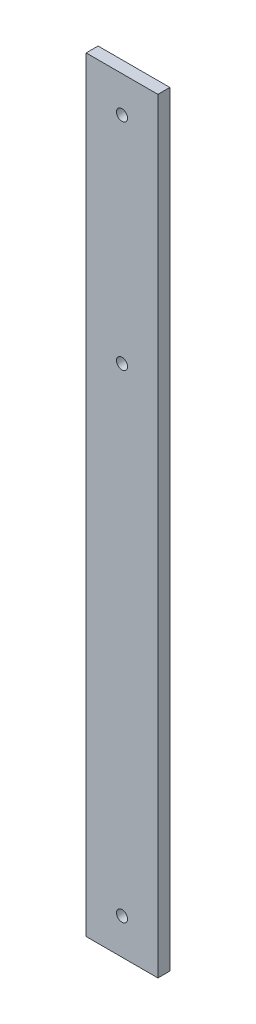
ISO-10303-21;
HEADER;
FILE_DESCRIPTION(('STEP AP214'),'2;1');
FILE_NAME('part.step','',(''),(''),'','','');
FILE_SCHEMA(('AUTOMOTIVE_DESIGN { 1 0 10303 214 1 1 1 1 }'));
ENDSEC;
DATA;
#1=APPLICATION_CONTEXT('core data for automotive mechanical design processes');
#2=APPLICATION_PROTOCOL_DEFINITION('international standard','automotive_design',2000,#1);
#3=PRODUCT_CONTEXT('',#1,'mechanical');
#4=PRODUCT('Part','Part','',(#3));
#5=PRODUCT_RELATED_PRODUCT_CATEGORY('part','',(#4));
#6=PRODUCT_DEFINITION_FORMATION('','',#4);
#7=PRODUCT_DEFINITION_CONTEXT('part definition',#1,'design');
#8=PRODUCT_DEFINITION('design','',#6,#7);
#9=PRODUCT_DEFINITION_SHAPE('','',#8);
#10=(LENGTH_UNIT() NAMED_UNIT(*) SI_UNIT(.MILLI.,.METRE.));
#11=(NAMED_UNIT(*) PLANE_ANGLE_UNIT() SI_UNIT($,.RADIAN.));
#12=(NAMED_UNIT(*) SI_UNIT($,.STERADIAN.) SOLID_ANGLE_UNIT());
#13=UNCERTAINTY_MEASURE_WITH_UNIT(LENGTH_MEASURE(1.E-05),#10,'distance_accuracy_value','');
#14=(GEOMETRIC_REPRESENTATION_CONTEXT(3) GLOBAL_UNCERTAINTY_ASSIGNED_CONTEXT((#13)) GLOBAL_UNIT_ASSIGNED_CONTEXT((#10,
#11,#12)) REPRESENTATION_CONTEXT('',''));
#15=CARTESIAN_POINT('',(0.,0.,0.));
#16=DIRECTION('',(0.,0.,1.));
#17=DIRECTION('',(1.,0.,0.));
#18=AXIS2_PLACEMENT_3D('',#15,#16,#17);
#19=CARTESIAN_POINT('',(0.,0.,3.175));
#20=DIRECTION('',(1.,0.,0.));
#21=DIRECTION('',(0.,0.,-1.));
#22=AXIS2_PLACEMENT_3D('',#19,#20,#21);
#23=PLANE('',#22);
#24=DIRECTION('',(0.,-1.,0.));
#25=VECTOR('',#24,1.);
#26=CARTESIAN_POINT('',(0.,0.,0.));
#27=LINE('',#26,#25);
#28=CARTESIAN_POINT('',(0.,203.2,0.));
#29=VERTEX_POINT('',#28);
#30=CARTESIAN_POINT('',(0.,0.,0.));
#31=VERTEX_POINT('',#30);
#32=EDGE_CURVE('E112',#29,#31,#27,.T.);
#33=ORIENTED_EDGE('',*,*,#32,.T.);
#34=DIRECTION('',(0.,0.,-1.));
#35=VECTOR('',#34,1.);
#36=CARTESIAN_POINT('',(0.,0.,3.175));
#37=LINE('',#36,#35);
#38=CARTESIAN_POINT('',(0.,0.,3.175));
#39=VERTEX_POINT('',#38);
#40=EDGE_CURVE('E11',#39,#31,#37,.T.);
#41=ORIENTED_EDGE('',*,*,#40,.F.);
#42=DIRECTION('',(0.,-1.,0.));
#43=VECTOR('',#42,1.);
#44=CARTESIAN_POINT('',(0.,0.,3.175));
#45=LINE('',#44,#43);
#46=CARTESIAN_POINT('',(0.,203.2,3.175));
#47=VERTEX_POINT('',#46);
#48=EDGE_CURVE('E96',#47,#39,#45,.T.);
#49=ORIENTED_EDGE('',*,*,#48,.F.);
#50=DIRECTION('',(0.,0.,-1.));
#51=VECTOR('',#50,1.);
#52=CARTESIAN_POINT('',(0.,203.2,3.175));
#53=LINE('',#52,#51);
#54=EDGE_CURVE('E108',#47,#29,#53,.T.);
#55=ORIENTED_EDGE('',*,*,#54,.T.);
#56=EDGE_LOOP('',(#33,#41,#49,#55));
#57=FACE_BOUND('',#56,.T.);
#58=ADVANCED_FACE('F44',(#57),#23,.F.);
#59=CARTESIAN_POINT('',(0.,0.,3.175));
#60=DIRECTION('',(0.,1.,0.));
#61=DIRECTION('',(0.,0.,1.));
#62=AXIS2_PLACEMENT_3D('',#59,#60,#61);
#63=PLANE('',#62);
#64=DIRECTION('',(1.,0.,0.));
#65=VECTOR('',#64,1.);
#66=CARTESIAN_POINT('',(0.,0.,0.));
#67=LINE('',#66,#65);
#68=CARTESIAN_POINT('',(19.05,0.,0.));
#69=VERTEX_POINT('',#68);
#70=EDGE_CURVE('E101',#31,#69,#67,.T.);
#71=ORIENTED_EDGE('',*,*,#70,.T.);
#72=DIRECTION('',(0.,0.,-1.));
#73=VECTOR('',#72,1.);
#74=CARTESIAN_POINT('',(19.05,0.,3.175));
#75=LINE('',#74,#73);
#76=CARTESIAN_POINT('',(19.05,0.,3.175));
#77=VERTEX_POINT('',#76);
#78=EDGE_CURVE('E53',#77,#69,#75,.T.);
#79=ORIENTED_EDGE('',*,*,#78,.F.);
#80=DIRECTION('',(1.,0.,0.));
#81=VECTOR('',#80,1.);
#82=CARTESIAN_POINT('',(0.,0.,3.175));
#83=LINE('',#82,#81);
#84=EDGE_CURVE('E91',#39,#77,#83,.T.);
#85=ORIENTED_EDGE('',*,*,#84,.F.);
#86=ORIENTED_EDGE('',*,*,#40,.T.);
#87=EDGE_LOOP('',(#71,#79,#85,#86));
#88=FACE_BOUND('',#87,.T.);
#89=ADVANCED_FACE('F100',(#88),#63,.F.);
#90=CARTESIAN_POINT('',(19.05,0.,3.175));
#91=DIRECTION('',(-1.,0.,0.));
#92=DIRECTION('',(0.,-1.,0.));
#93=AXIS2_PLACEMENT_3D('',#90,#91,#92);
#94=PLANE('',#93);
#95=DIRECTION('',(0.,1.,0.));
#96=VECTOR('',#95,1.);
#97=CARTESIAN_POINT('',(19.05,0.,0.));
#98=LINE('',#97,#96);
#99=CARTESIAN_POINT('',(19.05,203.2,0.));
#100=VERTEX_POINT('',#99);
#101=EDGE_CURVE('E78',#69,#100,#98,.T.);
#102=ORIENTED_EDGE('',*,*,#101,.T.);
#103=DIRECTION('',(0.,0.,-1.));
#104=VECTOR('',#103,1.);
#105=CARTESIAN_POINT('',(19.05,203.2,3.175));
#106=LINE('',#105,#104);
#107=CARTESIAN_POINT('',(19.05,203.2,3.175));
#108=VERTEX_POINT('',#107);
#109=EDGE_CURVE('E103',#108,#100,#106,.T.);
#110=ORIENTED_EDGE('',*,*,#109,.F.);
#111=DIRECTION('',(0.,1.,0.));
#112=VECTOR('',#111,1.);
#113=CARTESIAN_POINT('',(19.05,0.,3.175));
#114=LINE('',#113,#112);
#115=EDGE_CURVE('E94',#77,#108,#114,.T.);
#116=ORIENTED_EDGE('',*,*,#115,.F.);
#117=ORIENTED_EDGE('',*,*,#78,.T.);
#118=EDGE_LOOP('',(#102,#110,#116,#117));
#119=FACE_BOUND('',#118,.T.);
#120=ADVANCED_FACE('F104',(#119),#94,.F.);
#121=CARTESIAN_POINT('',(0.,203.2,3.175));
#122=DIRECTION('',(0.,-1.,0.));
#123=DIRECTION('',(0.,0.,-1.));
#124=AXIS2_PLACEMENT_3D('',#121,#122,#123);
#125=PLANE('',#124);
#126=DIRECTION('',(-1.,0.,0.));
#127=VECTOR('',#126,1.);
#128=CARTESIAN_POINT('',(0.,203.2,0.));
#129=LINE('',#128,#127);
#130=EDGE_CURVE('E84',#100,#29,#129,.T.);
#131=ORIENTED_EDGE('',*,*,#130,.T.);
#132=ORIENTED_EDGE('',*,*,#54,.F.);
#133=DIRECTION('',(-1.,0.,0.));
#134=VECTOR('',#133,1.);
#135=CARTESIAN_POINT('',(0.,203.2,3.175));
#136=LINE('',#135,#134);
#137=EDGE_CURVE('E61',#108,#47,#136,.T.);
#138=ORIENTED_EDGE('',*,*,#137,.F.);
#139=ORIENTED_EDGE('',*,*,#109,.T.);
#140=EDGE_LOOP('',(#131,#132,#138,#139));
#141=FACE_BOUND('',#140,.T.);
#142=ADVANCED_FACE('F126',(#141),#125,.F.);
#143=CARTESIAN_POINT('',(0.,0.,3.175));
#144=DIRECTION('',(0.,0.,-1.));
#145=DIRECTION('',(-1.,0.,0.));
#146=AXIS2_PLACEMENT_3D('',#143,#144,#145);
#147=PLANE('',#146);
#148=CARTESIAN_POINT('',(9.52499999999998,193.675,3.175));
#149=DIRECTION('',(0.,0.,1.));
#150=DIRECTION('',(1.,0.,0.));
#151=AXIS2_PLACEMENT_3D('',#148,#149,#150);
#152=CIRCLE('',#151,1.4605);
#153=CARTESIAN_POINT('',(10.9855,193.675,3.175));
#154=VERTEX_POINT('',#153);
#155=EDGE_CURVE('E149',#154,#154,#152,.T.);
#156=ORIENTED_EDGE('',*,*,#155,.F.);
#157=EDGE_LOOP('',(#156));
#158=FACE_BOUND('',#157,.T.);
#159=CARTESIAN_POINT('',(9.52499999999998,136.525,3.175));
#160=DIRECTION('',(0.,0.,1.));
#161=DIRECTION('',(1.,0.,0.));
#162=AXIS2_PLACEMENT_3D('',#159,#160,#161);
#163=CIRCLE('',#162,1.4605);
#164=CARTESIAN_POINT('',(10.9855,136.525,3.175));
#165=VERTEX_POINT('',#164);
#166=EDGE_CURVE('E145',#165,#165,#163,.T.);
#167=ORIENTED_EDGE('',*,*,#166,.F.);
#168=EDGE_LOOP('',(#167));
#169=FACE_BOUND('',#168,.T.);
#170=CARTESIAN_POINT('',(9.525,9.525,3.175));
#171=DIRECTION('',(0.,0.,1.));
#172=DIRECTION('',(1.,0.,0.));
#173=AXIS2_PLACEMENT_3D('',#170,#171,#172);
#174=CIRCLE('',#173,1.4605);
#175=CARTESIAN_POINT('',(10.9855,9.525,3.175));
#176=VERTEX_POINT('',#175);
#177=EDGE_CURVE('E137',#176,#176,#174,.T.);
#178=ORIENTED_EDGE('',*,*,#177,.F.);
#179=EDGE_LOOP('',(#178));
#180=FACE_BOUND('',#179,.T.);
#181=ORIENTED_EDGE('',*,*,#48,.T.);
#182=ORIENTED_EDGE('',*,*,#84,.T.);
#183=ORIENTED_EDGE('',*,*,#115,.T.);
#184=ORIENTED_EDGE('',*,*,#137,.T.);
#185=EDGE_LOOP('',(#181,#182,#183,#184));
#186=FACE_BOUND('',#185,.T.);
#187=ADVANCED_FACE('F92',(#158,#169,#180,#186),#147,.F.);
#188=CARTESIAN_POINT('',(0.,0.,0.));
#189=DIRECTION('',(0.,0.,-1.));
#190=DIRECTION('',(-1.,0.,0.));
#191=AXIS2_PLACEMENT_3D('',#188,#189,#190);
#192=PLANE('',#191);
#193=CARTESIAN_POINT('',(9.52499999999998,193.675,0.));
#194=DIRECTION('',(0.,0.,1.));
#195=DIRECTION('',(1.,0.,0.));
#196=AXIS2_PLACEMENT_3D('',#193,#194,#195);
#197=CIRCLE('',#196,1.4605);
#198=CARTESIAN_POINT('',(10.9855,193.675,0.));
#199=VERTEX_POINT('',#198);
#200=EDGE_CURVE('E116',#199,#199,#197,.T.);
#201=ORIENTED_EDGE('',*,*,#200,.T.);
#202=EDGE_LOOP('',(#201));
#203=FACE_BOUND('',#202,.T.);
#204=CARTESIAN_POINT('',(9.52499999999998,136.525,0.));
#205=DIRECTION('',(0.,0.,1.));
#206=DIRECTION('',(1.,0.,0.));
#207=AXIS2_PLACEMENT_3D('',#204,#205,#206);
#208=CIRCLE('',#207,1.4605);
#209=CARTESIAN_POINT('',(10.9855,136.525,0.));
#210=VERTEX_POINT('',#209);
#211=EDGE_CURVE('E141',#210,#210,#208,.T.);
#212=ORIENTED_EDGE('',*,*,#211,.T.);
#213=EDGE_LOOP('',(#212));
#214=FACE_BOUND('',#213,.T.);
#215=CARTESIAN_POINT('',(9.525,9.525,0.));
#216=DIRECTION('',(0.,0.,1.));
#217=DIRECTION('',(1.,0.,0.));
#218=AXIS2_PLACEMENT_3D('',#215,#216,#217);
#219=CIRCLE('',#218,1.4605);
#220=CARTESIAN_POINT('',(10.9855,9.525,0.));
#221=VERTEX_POINT('',#220);
#222=EDGE_CURVE('E133',#221,#221,#219,.T.);
#223=ORIENTED_EDGE('',*,*,#222,.T.);
#224=EDGE_LOOP('',(#223));
#225=FACE_BOUND('',#224,.T.);
#226=ORIENTED_EDGE('',*,*,#32,.F.);
#227=ORIENTED_EDGE('',*,*,#130,.F.);
#228=ORIENTED_EDGE('',*,*,#101,.F.);
#229=ORIENTED_EDGE('',*,*,#70,.F.);
#230=EDGE_LOOP('',(#226,#227,#228,#229));
#231=FACE_BOUND('',#230,.T.);
#232=ADVANCED_FACE('F129',(#203,#214,#225,#231),#192,.T.);
#233=CARTESIAN_POINT('',(9.525,9.525,0.));
#234=DIRECTION('',(0.,0.,1.));
#235=DIRECTION('',(1.,0.,0.));
#236=AXIS2_PLACEMENT_3D('',#233,#234,#235);
#237=CYLINDRICAL_SURFACE('',#236,1.4605);
#238=ORIENTED_EDGE('',*,*,#222,.F.);
#239=EDGE_LOOP('',(#238));
#240=FACE_BOUND('',#239,.T.);
#241=ORIENTED_EDGE('',*,*,#177,.T.);
#242=EDGE_LOOP('',(#241));
#243=FACE_BOUND('',#242,.T.);
#244=ADVANCED_FACE('F173',(#240,#243),#237,.F.);
#245=CARTESIAN_POINT('',(9.52499999999998,136.525,0.));
#246=DIRECTION('',(0.,0.,1.));
#247=DIRECTION('',(1.,0.,0.));
#248=AXIS2_PLACEMENT_3D('',#245,#246,#247);
#249=CYLINDRICAL_SURFACE('',#248,1.4605);
#250=ORIENTED_EDGE('',*,*,#211,.F.);
#251=EDGE_LOOP('',(#250));
#252=FACE_BOUND('',#251,.T.);
#253=ORIENTED_EDGE('',*,*,#166,.T.);
#254=EDGE_LOOP('',(#253));
#255=FACE_BOUND('',#254,.T.);
#256=ADVANCED_FACE('F162',(#252,#255),#249,.F.);
#257=CARTESIAN_POINT('',(9.52499999999998,193.675,0.));
#258=DIRECTION('',(0.,0.,1.));
#259=DIRECTION('',(1.,0.,0.));
#260=AXIS2_PLACEMENT_3D('',#257,#258,#259);
#261=CYLINDRICAL_SURFACE('',#260,1.4605);
#262=ORIENTED_EDGE('',*,*,#200,.F.);
#263=EDGE_LOOP('',(#262));
#264=FACE_BOUND('',#263,.T.);
#265=ORIENTED_EDGE('',*,*,#155,.T.);
#266=EDGE_LOOP('',(#265));
#267=FACE_BOUND('',#266,.T.);
#268=ADVANCED_FACE('F159',(#264,#267),#261,.F.);
#269=CLOSED_SHELL('',(#58,#89,#120,#142,#187,#232,#244,#256,#268));
#270=MANIFOLD_SOLID_BREP('B2',#269);
#271=ADVANCED_BREP_SHAPE_REPRESENTATION('',(#18,#270),#14);
#272=SHAPE_DEFINITION_REPRESENTATION(#9,#271);
ENDSEC;
END-ISO-10303-21;
